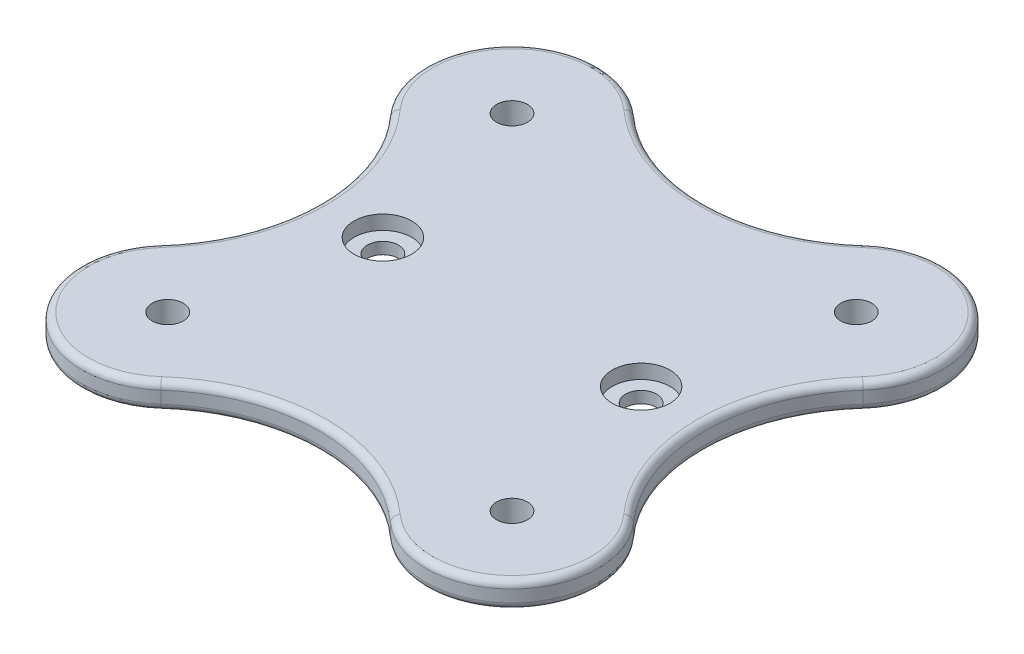
ISO-10303-21;
HEADER;
FILE_DESCRIPTION(('STEP AP214'),'2;1');
FILE_NAME('part.step','',(''),(''),'','','');
FILE_SCHEMA(('AUTOMOTIVE_DESIGN { 1 0 10303 214 1 1 1 1 }'));
ENDSEC;
DATA;
#1=APPLICATION_CONTEXT('core data for automotive mechanical design processes');
#2=APPLICATION_PROTOCOL_DEFINITION('international standard','automotive_design',2000,#1);
#3=PRODUCT_CONTEXT('',#1,'mechanical');
#4=PRODUCT('Part','Part','',(#3));
#5=PRODUCT_RELATED_PRODUCT_CATEGORY('part','',(#4));
#6=PRODUCT_DEFINITION_FORMATION('','',#4);
#7=PRODUCT_DEFINITION_CONTEXT('part definition',#1,'design');
#8=PRODUCT_DEFINITION('design','',#6,#7);
#9=PRODUCT_DEFINITION_SHAPE('','',#8);
#10=(LENGTH_UNIT() NAMED_UNIT(*) SI_UNIT(.MILLI.,.METRE.));
#11=(NAMED_UNIT(*) PLANE_ANGLE_UNIT() SI_UNIT($,.RADIAN.));
#12=(NAMED_UNIT(*) SI_UNIT($,.STERADIAN.) SOLID_ANGLE_UNIT());
#13=UNCERTAINTY_MEASURE_WITH_UNIT(LENGTH_MEASURE(1.E-05),#10,'distance_accuracy_value','');
#14=(GEOMETRIC_REPRESENTATION_CONTEXT(3) GLOBAL_UNCERTAINTY_ASSIGNED_CONTEXT((#13)) GLOBAL_UNIT_ASSIGNED_CONTEXT((#10,
#11,#12)) REPRESENTATION_CONTEXT('',''));
#15=CARTESIAN_POINT('',(0.,0.,0.));
#16=DIRECTION('',(0.,0.,1.));
#17=DIRECTION('',(1.,0.,0.));
#18=AXIS2_PLACEMENT_3D('',#15,#16,#17);
#19=CARTESIAN_POINT('',(20.,3.,-20.));
#20=DIRECTION('',(0.,-1.,0.));
#21=DIRECTION('',(0.,0.,-1.));
#22=AXIS2_PLACEMENT_3D('',#19,#20,#21);
#23=CYLINDRICAL_SURFACE('',#22,10.);
#24=DIRECTION('',(0.,-1.,0.));
#25=VECTOR('',#24,1.);
#26=CARTESIAN_POINT('',(27.4535599249993,3.,-13.3333333333333));
#27=LINE('',#26,#25);
#28=CARTESIAN_POINT('',(27.4535599249993,2.2,-13.3333333333333));
#29=VERTEX_POINT('',#28);
#30=CARTESIAN_POINT('',(27.4535599249993,0.8,-13.3333333333333));
#31=VERTEX_POINT('',#30);
#32=EDGE_CURVE('E377',#29,#31,#27,.T.);
#33=ORIENTED_EDGE('',*,*,#32,.T.);
#34=CARTESIAN_POINT('',(20.,0.8,-20.));
#35=DIRECTION('',(0.,1.,0.));
#36=DIRECTION('',(0.,0.,1.));
#37=AXIS2_PLACEMENT_3D('',#34,#35,#36);
#38=CIRCLE('',#37,10.);
#39=CARTESIAN_POINT('',(13.3333333333333,0.8,-27.4535599249993));
#40=VERTEX_POINT('',#39);
#41=EDGE_CURVE('E268',#31,#40,#38,.T.);
#42=ORIENTED_EDGE('',*,*,#41,.T.);
#43=DIRECTION('',(0.,-1.,0.));
#44=VECTOR('',#43,1.);
#45=CARTESIAN_POINT('',(13.3333333333333,3.,-27.4535599249993));
#46=LINE('',#45,#44);
#47=CARTESIAN_POINT('',(13.3333333333333,2.2,-27.4535599249993));
#48=VERTEX_POINT('',#47);
#49=EDGE_CURVE('E382',#40,#48,#46,.F.);
#50=ORIENTED_EDGE('',*,*,#49,.T.);
#51=CARTESIAN_POINT('',(20.,2.2,-20.));
#52=DIRECTION('',(0.,1.,0.));
#53=DIRECTION('',(0.,0.,1.));
#54=AXIS2_PLACEMENT_3D('',#51,#52,#53);
#55=CIRCLE('',#54,10.);
#56=EDGE_CURVE('E265',#48,#29,#55,.F.);
#57=ORIENTED_EDGE('',*,*,#56,.T.);
#58=EDGE_LOOP('',(#33,#42,#50,#57));
#59=FACE_BOUND('',#58,.T.);
#60=ADVANCED_FACE('F43',(#59),#23,.T.);
#61=CARTESIAN_POINT('',(-20.,3.,-20.));
#62=DIRECTION('',(0.,-1.,0.));
#63=DIRECTION('',(0.,0.,-1.));
#64=AXIS2_PLACEMENT_3D('',#61,#62,#63);
#65=CYLINDRICAL_SURFACE('',#64,9.99999999999999);
#66=DIRECTION('',(0.,-1.,0.));
#67=VECTOR('',#66,1.);
#68=CARTESIAN_POINT('',(-13.3333333333333,3.,-27.4535599249993));
#69=LINE('',#68,#67);
#70=CARTESIAN_POINT('',(-13.3333333333333,2.2,-27.4535599249993));
#71=VERTEX_POINT('',#70);
#72=CARTESIAN_POINT('',(-13.3333333333333,0.8,-27.4535599249993));
#73=VERTEX_POINT('',#72);
#74=EDGE_CURVE('E200',#71,#73,#69,.T.);
#75=ORIENTED_EDGE('',*,*,#74,.T.);
#76=CARTESIAN_POINT('',(-20.,0.8,-20.));
#77=DIRECTION('',(0.,1.,0.));
#78=DIRECTION('',(0.,0.,1.));
#79=AXIS2_PLACEMENT_3D('',#76,#77,#78);
#80=CIRCLE('',#79,9.99999999999999);
#81=CARTESIAN_POINT('',(-27.4535599249993,0.8,-13.3333333333333));
#82=VERTEX_POINT('',#81);
#83=EDGE_CURVE('E281',#73,#82,#80,.T.);
#84=ORIENTED_EDGE('',*,*,#83,.T.);
#85=DIRECTION('',(0.,-1.,0.));
#86=VECTOR('',#85,1.);
#87=CARTESIAN_POINT('',(-27.4535599249993,3.,-13.3333333333333));
#88=LINE('',#87,#86);
#89=CARTESIAN_POINT('',(-27.4535599249993,2.2,-13.3333333333333));
#90=VERTEX_POINT('',#89);
#91=EDGE_CURVE('E206',#82,#90,#88,.F.);
#92=ORIENTED_EDGE('',*,*,#91,.T.);
#93=CARTESIAN_POINT('',(-20.,2.2,-20.));
#94=DIRECTION('',(0.,1.,0.));
#95=DIRECTION('',(0.,0.,1.));
#96=AXIS2_PLACEMENT_3D('',#93,#94,#95);
#97=CIRCLE('',#96,9.99999999999999);
#98=EDGE_CURVE('E277',#90,#71,#97,.F.);
#99=ORIENTED_EDGE('',*,*,#98,.T.);
#100=EDGE_LOOP('',(#75,#84,#92,#99));
#101=FACE_BOUND('',#100,.T.);
#102=ADVANCED_FACE('F470',(#101),#65,.T.);
#103=CARTESIAN_POINT('',(-20.,3.,20.));
#104=DIRECTION('',(0.,-1.,0.));
#105=DIRECTION('',(0.,0.,-1.));
#106=AXIS2_PLACEMENT_3D('',#103,#104,#105);
#107=CYLINDRICAL_SURFACE('',#106,10.);
#108=DIRECTION('',(0.,-1.,0.));
#109=VECTOR('',#108,1.);
#110=CARTESIAN_POINT('',(-27.4535599249993,3.,13.3333333333333));
#111=LINE('',#110,#109);
#112=CARTESIAN_POINT('',(-27.4535599249993,2.2,13.3333333333333));
#113=VERTEX_POINT('',#112);
#114=CARTESIAN_POINT('',(-27.4535599249993,0.8,13.3333333333333));
#115=VERTEX_POINT('',#114);
#116=EDGE_CURVE('E191',#113,#115,#111,.T.);
#117=ORIENTED_EDGE('',*,*,#116,.T.);
#118=CARTESIAN_POINT('',(-20.,0.8,20.));
#119=DIRECTION('',(0.,1.,0.));
#120=DIRECTION('',(0.,0.,1.));
#121=AXIS2_PLACEMENT_3D('',#118,#119,#120);
#122=CIRCLE('',#121,10.);
#123=CARTESIAN_POINT('',(-13.3333333333333,0.8,27.4535599249993));
#124=VERTEX_POINT('',#123);
#125=EDGE_CURVE('E163',#115,#124,#122,.T.);
#126=ORIENTED_EDGE('',*,*,#125,.T.);
#127=DIRECTION('',(0.,-1.,0.));
#128=VECTOR('',#127,1.);
#129=CARTESIAN_POINT('',(-13.3333333333333,3.,27.4535599249993));
#130=LINE('',#129,#128);
#131=CARTESIAN_POINT('',(-13.3333333333333,2.2,27.4535599249993));
#132=VERTEX_POINT('',#131);
#133=EDGE_CURVE('E188',#124,#132,#130,.F.);
#134=ORIENTED_EDGE('',*,*,#133,.T.);
#135=CARTESIAN_POINT('',(-20.,2.2,20.));
#136=DIRECTION('',(0.,1.,0.));
#137=DIRECTION('',(0.,0.,1.));
#138=AXIS2_PLACEMENT_3D('',#135,#136,#137);
#139=CIRCLE('',#138,10.);
#140=EDGE_CURVE('E195',#132,#113,#139,.F.);
#141=ORIENTED_EDGE('',*,*,#140,.T.);
#142=EDGE_LOOP('',(#117,#126,#134,#141));
#143=FACE_BOUND('',#142,.T.);
#144=ADVANCED_FACE('F187',(#143),#107,.T.);
#145=CARTESIAN_POINT('',(20.,3.,20.));
#146=DIRECTION('',(0.,-1.,0.));
#147=DIRECTION('',(0.,0.,-1.));
#148=AXIS2_PLACEMENT_3D('',#145,#146,#147);
#149=CYLINDRICAL_SURFACE('',#148,9.99999999999999);
#150=DIRECTION('',(0.,-1.,0.));
#151=VECTOR('',#150,1.);
#152=CARTESIAN_POINT('',(13.3333333333333,3.,27.4535599249993));
#153=LINE('',#152,#151);
#154=CARTESIAN_POINT('',(13.3333333333333,2.2,27.4535599249993));
#155=VERTEX_POINT('',#154);
#156=CARTESIAN_POINT('',(13.3333333333333,0.8,27.4535599249993));
#157=VERTEX_POINT('',#156);
#158=EDGE_CURVE('E374',#155,#157,#153,.T.);
#159=ORIENTED_EDGE('',*,*,#158,.T.);
#160=CARTESIAN_POINT('',(20.,0.8,20.));
#161=DIRECTION('',(0.,1.,0.));
#162=DIRECTION('',(0.,0.,1.));
#163=AXIS2_PLACEMENT_3D('',#160,#161,#162);
#164=CIRCLE('',#163,9.99999999999999);
#165=CARTESIAN_POINT('',(27.4535599249993,0.8,13.3333333333333));
#166=VERTEX_POINT('',#165);
#167=EDGE_CURVE('E256',#157,#166,#164,.T.);
#168=ORIENTED_EDGE('',*,*,#167,.T.);
#169=DIRECTION('',(0.,-1.,0.));
#170=VECTOR('',#169,1.);
#171=CARTESIAN_POINT('',(27.4535599249993,3.,13.3333333333333));
#172=LINE('',#171,#170);
#173=CARTESIAN_POINT('',(27.4535599249993,2.2,13.3333333333333));
#174=VERTEX_POINT('',#173);
#175=EDGE_CURVE('E209',#166,#174,#172,.F.);
#176=ORIENTED_EDGE('',*,*,#175,.T.);
#177=CARTESIAN_POINT('',(20.,2.2,20.));
#178=DIRECTION('',(0.,1.,0.));
#179=DIRECTION('',(0.,0.,1.));
#180=AXIS2_PLACEMENT_3D('',#177,#178,#179);
#181=CIRCLE('',#180,9.99999999999999);
#182=EDGE_CURVE('E181',#174,#155,#181,.F.);
#183=ORIENTED_EDGE('',*,*,#182,.T.);
#184=EDGE_LOOP('',(#159,#168,#176,#183));
#185=FACE_BOUND('',#184,.T.);
#186=ADVANCED_FACE('F373',(#185),#149,.T.);
#187=CARTESIAN_POINT('',(0.,3.,0.));
#188=DIRECTION('',(0.,1.,0.));
#189=DIRECTION('',(0.,0.,1.));
#190=AXIS2_PLACEMENT_3D('',#187,#188,#189);
#191=PLANE('',#190);
#192=CARTESIAN_POINT('',(0.,3.,-42.3606797749979));
#193=DIRECTION('',(0.,1.,0.));
#194=DIRECTION('',(0.,0.,1.));
#195=AXIS2_PLACEMENT_3D('',#192,#193,#194);
#196=CIRCLE('',#195,20.8);
#197=CARTESIAN_POINT('',(13.8666666666667,3.,-26.8572751309994));
#198=VERTEX_POINT('',#197);
#199=CARTESIAN_POINT('',(-13.8666666666667,3.,-26.8572751309994));
#200=VERTEX_POINT('',#199);
#201=EDGE_CURVE('E61',#198,#200,#196,.F.);
#202=ORIENTED_EDGE('',*,*,#201,.T.);
#203=CARTESIAN_POINT('',(-20.,3.,-20.));
#204=DIRECTION('',(0.,1.,0.));
#205=DIRECTION('',(0.,0.,1.));
#206=AXIS2_PLACEMENT_3D('',#203,#204,#205);
#207=CIRCLE('',#206,9.19999999999999);
#208=CARTESIAN_POINT('',(-26.8572751309994,3.,-13.8666666666667));
#209=VERTEX_POINT('',#208);
#210=EDGE_CURVE('E302',#200,#209,#207,.T.);
#211=ORIENTED_EDGE('',*,*,#210,.T.);
#212=CARTESIAN_POINT('',(-42.3606797749979,3.,0.));
#213=DIRECTION('',(0.,1.,0.));
#214=DIRECTION('',(0.,0.,1.));
#215=AXIS2_PLACEMENT_3D('',#212,#213,#214);
#216=CIRCLE('',#215,20.8);
#217=CARTESIAN_POINT('',(-26.8572751309994,3.,13.8666666666667));
#218=VERTEX_POINT('',#217);
#219=EDGE_CURVE('E284',#209,#218,#216,.F.);
#220=ORIENTED_EDGE('',*,*,#219,.T.);
#221=CARTESIAN_POINT('',(-20.,3.,20.));
#222=DIRECTION('',(0.,1.,0.));
#223=DIRECTION('',(0.,0.,1.));
#224=AXIS2_PLACEMENT_3D('',#221,#222,#223);
#225=CIRCLE('',#224,9.20000000000001);
#226=CARTESIAN_POINT('',(-13.8666666666667,3.,26.8572751309994));
#227=VERTEX_POINT('',#226);
#228=EDGE_CURVE('E287',#218,#227,#225,.T.);
#229=ORIENTED_EDGE('',*,*,#228,.T.);
#230=CARTESIAN_POINT('',(0.,3.,42.3606797749979));
#231=DIRECTION('',(0.,1.,0.));
#232=DIRECTION('',(0.,0.,1.));
#233=AXIS2_PLACEMENT_3D('',#230,#231,#232);
#234=CIRCLE('',#233,20.8);
#235=CARTESIAN_POINT('',(13.8666666666667,3.,26.8572751309994));
#236=VERTEX_POINT('',#235);
#237=EDGE_CURVE('E290',#227,#236,#234,.F.);
#238=ORIENTED_EDGE('',*,*,#237,.T.);
#239=CARTESIAN_POINT('',(20.,3.,20.));
#240=DIRECTION('',(0.,1.,0.));
#241=DIRECTION('',(0.,0.,1.));
#242=AXIS2_PLACEMENT_3D('',#239,#240,#241);
#243=CIRCLE('',#242,9.19999999999999);
#244=CARTESIAN_POINT('',(26.8572751309993,3.,13.8666666666667));
#245=VERTEX_POINT('',#244);
#246=EDGE_CURVE('E293',#236,#245,#243,.T.);
#247=ORIENTED_EDGE('',*,*,#246,.T.);
#248=CARTESIAN_POINT('',(42.3606797749979,3.,0.));
#249=DIRECTION('',(0.,1.,0.));
#250=DIRECTION('',(0.,0.,1.));
#251=AXIS2_PLACEMENT_3D('',#248,#249,#250);
#252=CIRCLE('',#251,20.8);
#253=CARTESIAN_POINT('',(26.8572751309994,3.,-13.8666666666667));
#254=VERTEX_POINT('',#253);
#255=EDGE_CURVE('E296',#245,#254,#252,.F.);
#256=ORIENTED_EDGE('',*,*,#255,.T.);
#257=CARTESIAN_POINT('',(20.,3.,-20.));
#258=DIRECTION('',(0.,1.,0.));
#259=DIRECTION('',(0.,0.,1.));
#260=AXIS2_PLACEMENT_3D('',#257,#258,#259);
#261=CIRCLE('',#260,9.20000000000001);
#262=EDGE_CURVE('E66',#254,#198,#261,.T.);
#263=ORIENTED_EDGE('',*,*,#262,.T.);
#264=EDGE_LOOP('',(#202,#211,#220,#229,#238,#247,#256,#263));
#265=FACE_BOUND('',#264,.T.);
#266=CARTESIAN_POINT('',(15.,3.,0.));
#267=DIRECTION('',(0.,1.,0.));
#268=DIRECTION('',(0.,0.,1.));
#269=AXIS2_PLACEMENT_3D('',#266,#267,#268);
#270=CIRCLE('',#269,3.35);
#271=CARTESIAN_POINT('',(15.,3.,3.34999999999999));
#272=VERTEX_POINT('',#271);
#273=EDGE_CURVE('E331',#272,#272,#270,.T.);
#274=ORIENTED_EDGE('',*,*,#273,.F.);
#275=EDGE_LOOP('',(#274));
#276=FACE_BOUND('',#275,.T.);
#277=CARTESIAN_POINT('',(-15.,3.,0.));
#278=DIRECTION('',(0.,1.,0.));
#279=DIRECTION('',(0.,0.,1.));
#280=AXIS2_PLACEMENT_3D('',#277,#278,#279);
#281=CIRCLE('',#280,3.35);
#282=CARTESIAN_POINT('',(-15.,3.,3.35));
#283=VERTEX_POINT('',#282);
#284=EDGE_CURVE('E226',#283,#283,#281,.T.);
#285=ORIENTED_EDGE('',*,*,#284,.F.);
#286=EDGE_LOOP('',(#285));
#287=FACE_BOUND('',#286,.T.);
#288=CARTESIAN_POINT('',(-20.,3.,-20.));
#289=DIRECTION('',(0.,1.,0.));
#290=DIRECTION('',(0.,0.,1.));
#291=AXIS2_PLACEMENT_3D('',#288,#289,#290);
#292=CIRCLE('',#291,1.8);
#293=CARTESIAN_POINT('',(-20.,3.,-18.2));
#294=VERTEX_POINT('',#293);
#295=EDGE_CURVE('E220',#294,#294,#292,.T.);
#296=ORIENTED_EDGE('',*,*,#295,.F.);
#297=EDGE_LOOP('',(#296));
#298=FACE_BOUND('',#297,.T.);
#299=CARTESIAN_POINT('',(20.,3.,20.));
#300=DIRECTION('',(0.,1.,0.));
#301=DIRECTION('',(0.,0.,1.));
#302=AXIS2_PLACEMENT_3D('',#299,#300,#301);
#303=CIRCLE('',#302,1.8);
#304=CARTESIAN_POINT('',(20.,3.,21.8));
#305=VERTEX_POINT('',#304);
#306=EDGE_CURVE('E393',#305,#305,#303,.T.);
#307=ORIENTED_EDGE('',*,*,#306,.F.);
#308=EDGE_LOOP('',(#307));
#309=FACE_BOUND('',#308,.T.);
#310=CARTESIAN_POINT('',(-20.,3.,20.));
#311=DIRECTION('',(0.,1.,0.));
#312=DIRECTION('',(0.,0.,1.));
#313=AXIS2_PLACEMENT_3D('',#310,#311,#312);
#314=CIRCLE('',#313,1.8);
#315=CARTESIAN_POINT('',(-20.,3.,21.8));
#316=VERTEX_POINT('',#315);
#317=EDGE_CURVE('E399',#316,#316,#314,.T.);
#318=ORIENTED_EDGE('',*,*,#317,.F.);
#319=EDGE_LOOP('',(#318));
#320=FACE_BOUND('',#319,.T.);
#321=CARTESIAN_POINT('',(20.,3.,-20.));
#322=DIRECTION('',(0.,1.,0.));
#323=DIRECTION('',(0.,0.,1.));
#324=AXIS2_PLACEMENT_3D('',#321,#322,#323);
#325=CIRCLE('',#324,1.8);
#326=CARTESIAN_POINT('',(20.,3.,-18.2));
#327=VERTEX_POINT('',#326);
#328=EDGE_CURVE('E398',#327,#327,#325,.T.);
#329=ORIENTED_EDGE('',*,*,#328,.F.);
#330=EDGE_LOOP('',(#329));
#331=FACE_BOUND('',#330,.T.);
#332=ADVANCED_FACE('F441',(#265,#276,#287,#298,#309,#320,#331),#191,.T.);
#333=CARTESIAN_POINT('',(0.,0.,0.));
#334=DIRECTION('',(0.,1.,0.));
#335=DIRECTION('',(0.,0.,1.));
#336=AXIS2_PLACEMENT_3D('',#333,#334,#335);
#337=PLANE('',#336);
#338=CARTESIAN_POINT('',(0.,0.,42.3606797749979));
#339=DIRECTION('',(0.,1.,0.));
#340=DIRECTION('',(0.,0.,1.));
#341=AXIS2_PLACEMENT_3D('',#338,#339,#340);
#342=CIRCLE('',#341,20.8);
#343=CARTESIAN_POINT('',(13.8666666666667,0.,26.8572751309994));
#344=VERTEX_POINT('',#343);
#345=CARTESIAN_POINT('',(-13.8666666666666,0.,26.8572751309994));
#346=VERTEX_POINT('',#345);
#347=EDGE_CURVE('E247',#344,#346,#342,.T.);
#348=ORIENTED_EDGE('',*,*,#347,.T.);
#349=CARTESIAN_POINT('',(-20.,0.,20.));
#350=DIRECTION('',(0.,1.,0.));
#351=DIRECTION('',(0.,0.,1.));
#352=AXIS2_PLACEMENT_3D('',#349,#350,#351);
#353=CIRCLE('',#352,9.20000000000001);
#354=CARTESIAN_POINT('',(-26.8572751309994,0.,13.8666666666667));
#355=VERTEX_POINT('',#354);
#356=EDGE_CURVE('E165',#346,#355,#353,.F.);
#357=ORIENTED_EDGE('',*,*,#356,.T.);
#358=CARTESIAN_POINT('',(-42.3606797749979,0.,0.));
#359=DIRECTION('',(0.,1.,0.));
#360=DIRECTION('',(0.,0.,1.));
#361=AXIS2_PLACEMENT_3D('',#358,#359,#360);
#362=CIRCLE('',#361,20.8);
#363=CARTESIAN_POINT('',(-26.8572751309994,0.,-13.8666666666667));
#364=VERTEX_POINT('',#363);
#365=EDGE_CURVE('E194',#355,#364,#362,.T.);
#366=ORIENTED_EDGE('',*,*,#365,.T.);
#367=CARTESIAN_POINT('',(-20.,0.,-20.));
#368=DIRECTION('',(0.,1.,0.));
#369=DIRECTION('',(0.,0.,1.));
#370=AXIS2_PLACEMENT_3D('',#367,#368,#369);
#371=CIRCLE('',#370,9.19999999999999);
#372=CARTESIAN_POINT('',(-13.8666666666667,0.,-26.8572751309994));
#373=VERTEX_POINT('',#372);
#374=EDGE_CURVE('E232',#364,#373,#371,.F.);
#375=ORIENTED_EDGE('',*,*,#374,.T.);
#376=CARTESIAN_POINT('',(0.,0.,-42.3606797749979));
#377=DIRECTION('',(0.,1.,0.));
#378=DIRECTION('',(0.,0.,1.));
#379=AXIS2_PLACEMENT_3D('',#376,#377,#378);
#380=CIRCLE('',#379,20.8);
#381=CARTESIAN_POINT('',(13.8666666666667,0.,-26.8572751309994));
#382=VERTEX_POINT('',#381);
#383=EDGE_CURVE('E235',#373,#382,#380,.T.);
#384=ORIENTED_EDGE('',*,*,#383,.T.);
#385=CARTESIAN_POINT('',(20.,0.,-20.));
#386=DIRECTION('',(0.,1.,0.));
#387=DIRECTION('',(0.,0.,1.));
#388=AXIS2_PLACEMENT_3D('',#385,#386,#387);
#389=CIRCLE('',#388,9.20000000000001);
#390=CARTESIAN_POINT('',(26.8572751309994,0.,-13.8666666666667));
#391=VERTEX_POINT('',#390);
#392=EDGE_CURVE('E238',#382,#391,#389,.F.);
#393=ORIENTED_EDGE('',*,*,#392,.T.);
#394=CARTESIAN_POINT('',(42.3606797749979,0.,0.));
#395=DIRECTION('',(0.,1.,0.));
#396=DIRECTION('',(0.,0.,1.));
#397=AXIS2_PLACEMENT_3D('',#394,#395,#396);
#398=CIRCLE('',#397,20.8);
#399=CARTESIAN_POINT('',(26.8572751309994,0.,13.8666666666667));
#400=VERTEX_POINT('',#399);
#401=EDGE_CURVE('E241',#391,#400,#398,.T.);
#402=ORIENTED_EDGE('',*,*,#401,.T.);
#403=CARTESIAN_POINT('',(20.,0.,20.));
#404=DIRECTION('',(0.,1.,0.));
#405=DIRECTION('',(0.,0.,1.));
#406=AXIS2_PLACEMENT_3D('',#403,#404,#405);
#407=CIRCLE('',#406,9.19999999999999);
#408=EDGE_CURVE('E244',#400,#344,#407,.F.);
#409=ORIENTED_EDGE('',*,*,#408,.T.);
#410=EDGE_LOOP('',(#348,#357,#366,#375,#384,#393,#402,#409));
#411=FACE_BOUND('',#410,.T.);
#412=CARTESIAN_POINT('',(15.,0.,0.));
#413=DIRECTION('',(0.,1.,0.));
#414=DIRECTION('',(0.,0.,1.));
#415=AXIS2_PLACEMENT_3D('',#412,#413,#414);
#416=CIRCLE('',#415,1.8);
#417=CARTESIAN_POINT('',(15.,0.,1.8));
#418=VERTEX_POINT('',#417);
#419=EDGE_CURVE('E222',#418,#418,#416,.T.);
#420=ORIENTED_EDGE('',*,*,#419,.T.);
#421=EDGE_LOOP('',(#420));
#422=FACE_BOUND('',#421,.T.);
#423=CARTESIAN_POINT('',(-15.,0.,0.));
#424=DIRECTION('',(0.,1.,0.));
#425=DIRECTION('',(0.,0.,1.));
#426=AXIS2_PLACEMENT_3D('',#423,#424,#425);
#427=CIRCLE('',#426,1.8);
#428=CARTESIAN_POINT('',(-15.,0.,1.8));
#429=VERTEX_POINT('',#428);
#430=EDGE_CURVE('E216',#429,#429,#427,.T.);
#431=ORIENTED_EDGE('',*,*,#430,.T.);
#432=EDGE_LOOP('',(#431));
#433=FACE_BOUND('',#432,.T.);
#434=CARTESIAN_POINT('',(-20.,0.,-20.));
#435=DIRECTION('',(0.,1.,0.));
#436=DIRECTION('',(0.,0.,1.));
#437=AXIS2_PLACEMENT_3D('',#434,#435,#436);
#438=CIRCLE('',#437,1.8);
#439=CARTESIAN_POINT('',(-20.,0.,-18.2));
#440=VERTEX_POINT('',#439);
#441=EDGE_CURVE('E389',#440,#440,#438,.T.);
#442=ORIENTED_EDGE('',*,*,#441,.T.);
#443=EDGE_LOOP('',(#442));
#444=FACE_BOUND('',#443,.T.);
#445=CARTESIAN_POINT('',(20.,0.,20.));
#446=DIRECTION('',(0.,1.,0.));
#447=DIRECTION('',(0.,0.,1.));
#448=AXIS2_PLACEMENT_3D('',#445,#446,#447);
#449=CIRCLE('',#448,1.8);
#450=CARTESIAN_POINT('',(20.,0.,21.8));
#451=VERTEX_POINT('',#450);
#452=EDGE_CURVE('E409',#451,#451,#449,.T.);
#453=ORIENTED_EDGE('',*,*,#452,.T.);
#454=EDGE_LOOP('',(#453));
#455=FACE_BOUND('',#454,.T.);
#456=CARTESIAN_POINT('',(-20.,0.,20.));
#457=DIRECTION('',(0.,1.,0.));
#458=DIRECTION('',(0.,0.,1.));
#459=AXIS2_PLACEMENT_3D('',#456,#457,#458);
#460=CIRCLE('',#459,1.8);
#461=CARTESIAN_POINT('',(-20.,0.,21.8));
#462=VERTEX_POINT('',#461);
#463=EDGE_CURVE('E394',#462,#462,#460,.T.);
#464=ORIENTED_EDGE('',*,*,#463,.T.);
#465=EDGE_LOOP('',(#464));
#466=FACE_BOUND('',#465,.T.);
#467=CARTESIAN_POINT('',(20.,0.,-20.));
#468=DIRECTION('',(0.,1.,0.));
#469=DIRECTION('',(0.,0.,1.));
#470=AXIS2_PLACEMENT_3D('',#467,#468,#469);
#471=CIRCLE('',#470,1.8);
#472=CARTESIAN_POINT('',(20.,0.,-18.2));
#473=VERTEX_POINT('',#472);
#474=EDGE_CURVE('E388',#473,#473,#471,.T.);
#475=ORIENTED_EDGE('',*,*,#474,.T.);
#476=EDGE_LOOP('',(#475));
#477=FACE_BOUND('',#476,.T.);
#478=ADVANCED_FACE('F444',(#411,#422,#433,#444,#455,#466,#477),#337,.F.);
#479=CARTESIAN_POINT('',(20.,3.,-20.));
#480=DIRECTION('',(0.,1.,0.));
#481=DIRECTION('',(0.,0.,1.));
#482=AXIS2_PLACEMENT_3D('',#479,#480,#481);
#483=CYLINDRICAL_SURFACE('',#482,1.8);
#484=ORIENTED_EDGE('',*,*,#328,.T.);
#485=EDGE_LOOP('',(#484));
#486=FACE_BOUND('',#485,.T.);
#487=ORIENTED_EDGE('',*,*,#474,.F.);
#488=EDGE_LOOP('',(#487));
#489=FACE_BOUND('',#488,.T.);
#490=ADVANCED_FACE('F456',(#486,#489),#483,.F.);
#491=CARTESIAN_POINT('',(-20.,3.,20.));
#492=DIRECTION('',(0.,1.,0.));
#493=DIRECTION('',(0.,0.,1.));
#494=AXIS2_PLACEMENT_3D('',#491,#492,#493);
#495=CYLINDRICAL_SURFACE('',#494,1.8);
#496=ORIENTED_EDGE('',*,*,#317,.T.);
#497=EDGE_LOOP('',(#496));
#498=FACE_BOUND('',#497,.T.);
#499=ORIENTED_EDGE('',*,*,#463,.F.);
#500=EDGE_LOOP('',(#499));
#501=FACE_BOUND('',#500,.T.);
#502=ADVANCED_FACE('F459',(#498,#501),#495,.F.);
#503=CARTESIAN_POINT('',(20.,3.,20.));
#504=DIRECTION('',(0.,1.,0.));
#505=DIRECTION('',(0.,0.,1.));
#506=AXIS2_PLACEMENT_3D('',#503,#504,#505);
#507=CYLINDRICAL_SURFACE('',#506,1.8);
#508=ORIENTED_EDGE('',*,*,#306,.T.);
#509=EDGE_LOOP('',(#508));
#510=FACE_BOUND('',#509,.T.);
#511=ORIENTED_EDGE('',*,*,#452,.F.);
#512=EDGE_LOOP('',(#511));
#513=FACE_BOUND('',#512,.T.);
#514=ADVANCED_FACE('F630',(#510,#513),#507,.F.);
#515=CARTESIAN_POINT('',(-20.,3.,-20.));
#516=DIRECTION('',(0.,1.,0.));
#517=DIRECTION('',(0.,0.,1.));
#518=AXIS2_PLACEMENT_3D('',#515,#516,#517);
#519=CYLINDRICAL_SURFACE('',#518,1.8);
#520=ORIENTED_EDGE('',*,*,#295,.T.);
#521=EDGE_LOOP('',(#520));
#522=FACE_BOUND('',#521,.T.);
#523=ORIENTED_EDGE('',*,*,#441,.F.);
#524=EDGE_LOOP('',(#523));
#525=FACE_BOUND('',#524,.T.);
#526=ADVANCED_FACE('F482',(#522,#525),#519,.F.);
#527=CARTESIAN_POINT('',(42.3606797749979,3.,0.));
#528=DIRECTION('',(0.,1.,0.));
#529=DIRECTION('',(0.,0.,1.));
#530=AXIS2_PLACEMENT_3D('',#527,#528,#529);
#531=CYLINDRICAL_SURFACE('',#530,20.);
#532=ORIENTED_EDGE('',*,*,#175,.F.);
#533=CARTESIAN_POINT('',(42.3606797749979,0.8,0.));
#534=DIRECTION('',(0.,1.,0.));
#535=DIRECTION('',(0.,0.,1.));
#536=AXIS2_PLACEMENT_3D('',#533,#534,#535);
#537=CIRCLE('',#536,20.);
#538=EDGE_CURVE('E262',#166,#31,#537,.F.);
#539=ORIENTED_EDGE('',*,*,#538,.T.);
#540=ORIENTED_EDGE('',*,*,#32,.F.);
#541=CARTESIAN_POINT('',(42.3606797749979,2.2,0.));
#542=DIRECTION('',(0.,1.,0.));
#543=DIRECTION('',(0.,0.,1.));
#544=AXIS2_PLACEMENT_3D('',#541,#542,#543);
#545=CIRCLE('',#544,20.);
#546=EDGE_CURVE('E259',#29,#174,#545,.T.);
#547=ORIENTED_EDGE('',*,*,#546,.T.);
#548=EDGE_LOOP('',(#532,#539,#540,#547));
#549=FACE_BOUND('',#548,.T.);
#550=ADVANCED_FACE('F479',(#549),#531,.F.);
#551=CARTESIAN_POINT('',(0.,3.,42.3606797749979));
#552=DIRECTION('',(0.,1.,0.));
#553=DIRECTION('',(0.,0.,1.));
#554=AXIS2_PLACEMENT_3D('',#551,#552,#553);
#555=CYLINDRICAL_SURFACE('',#554,20.);
#556=ORIENTED_EDGE('',*,*,#133,.F.);
#557=CARTESIAN_POINT('',(0.,0.8,42.3606797749979));
#558=DIRECTION('',(0.,1.,0.));
#559=DIRECTION('',(0.,0.,1.));
#560=AXIS2_PLACEMENT_3D('',#557,#558,#559);
#561=CIRCLE('',#560,20.);
#562=EDGE_CURVE('E172',#124,#157,#561,.F.);
#563=ORIENTED_EDGE('',*,*,#562,.T.);
#564=ORIENTED_EDGE('',*,*,#158,.F.);
#565=CARTESIAN_POINT('',(0.,2.2,42.3606797749979));
#566=DIRECTION('',(0.,1.,0.));
#567=DIRECTION('',(0.,0.,1.));
#568=AXIS2_PLACEMENT_3D('',#565,#566,#567);
#569=CIRCLE('',#568,20.);
#570=EDGE_CURVE('E182',#155,#132,#569,.T.);
#571=ORIENTED_EDGE('',*,*,#570,.T.);
#572=EDGE_LOOP('',(#556,#563,#564,#571));
#573=FACE_BOUND('',#572,.T.);
#574=ADVANCED_FACE('F197',(#573),#555,.F.);
#575=CARTESIAN_POINT('',(-42.3606797749979,3.,0.));
#576=DIRECTION('',(0.,1.,0.));
#577=DIRECTION('',(0.,0.,1.));
#578=AXIS2_PLACEMENT_3D('',#575,#576,#577);
#579=CYLINDRICAL_SURFACE('',#578,20.);
#580=ORIENTED_EDGE('',*,*,#91,.F.);
#581=CARTESIAN_POINT('',(-42.3606797749979,0.8,0.));
#582=DIRECTION('',(0.,1.,0.));
#583=DIRECTION('',(0.,0.,1.));
#584=AXIS2_PLACEMENT_3D('',#581,#582,#583);
#585=CIRCLE('',#584,20.);
#586=EDGE_CURVE('E11',#82,#115,#585,.F.);
#587=ORIENTED_EDGE('',*,*,#586,.T.);
#588=ORIENTED_EDGE('',*,*,#116,.F.);
#589=CARTESIAN_POINT('',(-42.3606797749979,2.2,0.));
#590=DIRECTION('',(0.,1.,0.));
#591=DIRECTION('',(0.,0.,1.));
#592=AXIS2_PLACEMENT_3D('',#589,#590,#591);
#593=CIRCLE('',#592,20.);
#594=EDGE_CURVE('E53',#113,#90,#593,.T.);
#595=ORIENTED_EDGE('',*,*,#594,.T.);
#596=EDGE_LOOP('',(#580,#587,#588,#595));
#597=FACE_BOUND('',#596,.T.);
#598=ADVANCED_FACE('F486',(#597),#579,.F.);
#599=CARTESIAN_POINT('',(0.,3.,-42.3606797749979));
#600=DIRECTION('',(0.,1.,0.));
#601=DIRECTION('',(0.,0.,1.));
#602=AXIS2_PLACEMENT_3D('',#599,#600,#601);
#603=CYLINDRICAL_SURFACE('',#602,20.);
#604=ORIENTED_EDGE('',*,*,#49,.F.);
#605=CARTESIAN_POINT('',(0.,0.8,-42.3606797749979));
#606=DIRECTION('',(0.,1.,0.));
#607=DIRECTION('',(0.,0.,1.));
#608=AXIS2_PLACEMENT_3D('',#605,#606,#607);
#609=CIRCLE('',#608,20.);
#610=EDGE_CURVE('E274',#40,#73,#609,.F.);
#611=ORIENTED_EDGE('',*,*,#610,.T.);
#612=ORIENTED_EDGE('',*,*,#74,.F.);
#613=CARTESIAN_POINT('',(0.,2.2,-42.3606797749979));
#614=DIRECTION('',(0.,1.,0.));
#615=DIRECTION('',(0.,0.,1.));
#616=AXIS2_PLACEMENT_3D('',#613,#614,#615);
#617=CIRCLE('',#616,20.);
#618=EDGE_CURVE('E271',#71,#48,#617,.T.);
#619=ORIENTED_EDGE('',*,*,#618,.T.);
#620=EDGE_LOOP('',(#604,#611,#612,#619));
#621=FACE_BOUND('',#620,.T.);
#622=ADVANCED_FACE('F489',(#621),#603,.F.);
#623=CARTESIAN_POINT('',(-15.,3.,0.));
#624=DIRECTION('',(0.,1.,0.));
#625=DIRECTION('',(0.,0.,1.));
#626=AXIS2_PLACEMENT_3D('',#623,#624,#625);
#627=CYLINDRICAL_SURFACE('',#626,1.8);
#628=CARTESIAN_POINT('',(-15.,1.35,0.));
#629=DIRECTION('',(0.,1.,0.));
#630=DIRECTION('',(0.,0.,1.));
#631=AXIS2_PLACEMENT_3D('',#628,#629,#630);
#632=CIRCLE('',#631,1.8);
#633=CARTESIAN_POINT('',(-15.,1.35,1.8));
#634=VERTEX_POINT('',#633);
#635=EDGE_CURVE('E221',#634,#634,#632,.T.);
#636=ORIENTED_EDGE('',*,*,#635,.T.);
#637=EDGE_LOOP('',(#636));
#638=FACE_BOUND('',#637,.T.);
#639=ORIENTED_EDGE('',*,*,#430,.F.);
#640=EDGE_LOOP('',(#639));
#641=FACE_BOUND('',#640,.T.);
#642=ADVANCED_FACE('F493',(#638,#641),#627,.F.);
#643=CARTESIAN_POINT('',(-13.2,1.35,0.));
#644=DIRECTION('',(0.,-1.,0.));
#645=DIRECTION('',(0.,0.,-1.));
#646=AXIS2_PLACEMENT_3D('',#643,#644,#645);
#647=PLANE('',#646);
#648=ORIENTED_EDGE('',*,*,#635,.F.);
#649=EDGE_LOOP('',(#648));
#650=FACE_BOUND('',#649,.T.);
#651=CARTESIAN_POINT('',(-15.,1.35,0.));
#652=DIRECTION('',(0.,1.,0.));
#653=DIRECTION('',(0.,0.,1.));
#654=AXIS2_PLACEMENT_3D('',#651,#652,#653);
#655=CIRCLE('',#654,3.35);
#656=CARTESIAN_POINT('',(-15.,1.35,3.35));
#657=VERTEX_POINT('',#656);
#658=EDGE_CURVE('E422',#657,#657,#655,.T.);
#659=ORIENTED_EDGE('',*,*,#658,.T.);
#660=EDGE_LOOP('',(#659));
#661=FACE_BOUND('',#660,.T.);
#662=ADVANCED_FACE('F600',(#650,#661),#647,.F.);
#663=CARTESIAN_POINT('',(-15.,3.,0.));
#664=DIRECTION('',(0.,1.,0.));
#665=DIRECTION('',(0.,0.,1.));
#666=AXIS2_PLACEMENT_3D('',#663,#664,#665);
#667=CYLINDRICAL_SURFACE('',#666,3.35);
#668=ORIENTED_EDGE('',*,*,#658,.F.);
#669=EDGE_LOOP('',(#668));
#670=FACE_BOUND('',#669,.T.);
#671=ORIENTED_EDGE('',*,*,#284,.T.);
#672=EDGE_LOOP('',(#671));
#673=FACE_BOUND('',#672,.T.);
#674=ADVANCED_FACE('F593',(#670,#673),#667,.F.);
#675=CARTESIAN_POINT('',(15.,3.,0.));
#676=DIRECTION('',(0.,1.,0.));
#677=DIRECTION('',(0.,0.,1.));
#678=AXIS2_PLACEMENT_3D('',#675,#676,#677);
#679=CYLINDRICAL_SURFACE('',#678,1.8);
#680=CARTESIAN_POINT('',(15.,1.35,0.));
#681=DIRECTION('',(0.,1.,0.));
#682=DIRECTION('',(0.,0.,1.));
#683=AXIS2_PLACEMENT_3D('',#680,#681,#682);
#684=CIRCLE('',#683,1.8);
#685=CARTESIAN_POINT('',(15.,1.35,1.8));
#686=VERTEX_POINT('',#685);
#687=EDGE_CURVE('E227',#686,#686,#684,.T.);
#688=ORIENTED_EDGE('',*,*,#687,.T.);
#689=EDGE_LOOP('',(#688));
#690=FACE_BOUND('',#689,.T.);
#691=ORIENTED_EDGE('',*,*,#419,.F.);
#692=EDGE_LOOP('',(#691));
#693=FACE_BOUND('',#692,.T.);
#694=ADVANCED_FACE('F586',(#690,#693),#679,.F.);
#695=CARTESIAN_POINT('',(16.8,1.35,0.));
#696=DIRECTION('',(0.,-1.,0.));
#697=DIRECTION('',(0.,0.,-1.));
#698=AXIS2_PLACEMENT_3D('',#695,#696,#697);
#699=PLANE('',#698);
#700=ORIENTED_EDGE('',*,*,#687,.F.);
#701=EDGE_LOOP('',(#700));
#702=FACE_BOUND('',#701,.T.);
#703=CARTESIAN_POINT('',(15.,1.35,0.));
#704=DIRECTION('',(0.,1.,0.));
#705=DIRECTION('',(0.,0.,1.));
#706=AXIS2_PLACEMENT_3D('',#703,#704,#705);
#707=CIRCLE('',#706,3.35);
#708=CARTESIAN_POINT('',(15.,1.35,3.34999999999999));
#709=VERTEX_POINT('',#708);
#710=EDGE_CURVE('E431',#709,#709,#707,.T.);
#711=ORIENTED_EDGE('',*,*,#710,.T.);
#712=EDGE_LOOP('',(#711));
#713=FACE_BOUND('',#712,.T.);
#714=ADVANCED_FACE('F579',(#702,#713),#699,.F.);
#715=CARTESIAN_POINT('',(15.,3.,0.));
#716=DIRECTION('',(0.,1.,0.));
#717=DIRECTION('',(0.,0.,1.));
#718=AXIS2_PLACEMENT_3D('',#715,#716,#717);
#719=CYLINDRICAL_SURFACE('',#718,3.35);
#720=ORIENTED_EDGE('',*,*,#710,.F.);
#721=EDGE_LOOP('',(#720));
#722=FACE_BOUND('',#721,.T.);
#723=ORIENTED_EDGE('',*,*,#273,.T.);
#724=EDGE_LOOP('',(#723));
#725=FACE_BOUND('',#724,.T.);
#726=ADVANCED_FACE('F439',(#722,#725),#719,.F.);
#727=CARTESIAN_POINT('',(20.,0.8,-20.));
#728=DIRECTION('',(0.,1.,0.));
#729=DIRECTION('',(0.,0.,1.));
#730=AXIS2_PLACEMENT_3D('',#727,#728,#729);
#731=TOROIDAL_SURFACE('',#730,9.20000000000001,0.8);
#732=CARTESIAN_POINT('',(26.8572751309994,0.8,-13.8666666666667));
#733=DIRECTION('',(-0.666666666666666,0.,0.74535599249993));
#734=DIRECTION('',(0.74535599249993,0.,0.666666666666666));
#735=AXIS2_PLACEMENT_3D('',#732,#733,#734);
#736=CIRCLE('',#735,0.8);
#737=EDGE_CURVE('E323',#391,#31,#736,.T.);
#738=ORIENTED_EDGE('',*,*,#737,.F.);
#739=ORIENTED_EDGE('',*,*,#392,.F.);
#740=CARTESIAN_POINT('',(13.8666666666667,0.8,-26.8572751309994));
#741=DIRECTION('',(-0.74535599249993,0.,0.666666666666666));
#742=DIRECTION('',(0.666666666666666,0.,0.74535599249993));
#743=AXIS2_PLACEMENT_3D('',#740,#741,#742);
#744=CIRCLE('',#743,0.8);
#745=EDGE_CURVE('E327',#40,#382,#744,.T.);
#746=ORIENTED_EDGE('',*,*,#745,.F.);
#747=ORIENTED_EDGE('',*,*,#41,.F.);
#748=EDGE_LOOP('',(#738,#739,#746,#747));
#749=FACE_BOUND('',#748,.T.);
#750=ADVANCED_FACE('F518',(#749),#731,.T.);
#751=CARTESIAN_POINT('',(0.,0.8,-42.3606797749979));
#752=DIRECTION('',(0.,1.,0.));
#753=DIRECTION('',(0.,0.,1.));
#754=AXIS2_PLACEMENT_3D('',#751,#752,#753);
#755=TOROIDAL_SURFACE('',#754,20.8,0.8);
#756=ORIENTED_EDGE('',*,*,#745,.T.);
#757=ORIENTED_EDGE('',*,*,#383,.F.);
#758=CARTESIAN_POINT('',(-13.8666666666667,0.8,-26.8572751309994));
#759=DIRECTION('',(-0.74535599249993,0.,-0.666666666666666));
#760=DIRECTION('',(-0.666666666666666,0.,0.74535599249993));
#761=AXIS2_PLACEMENT_3D('',#758,#759,#760);
#762=CIRCLE('',#761,0.8);
#763=EDGE_CURVE('E319',#73,#373,#762,.T.);
#764=ORIENTED_EDGE('',*,*,#763,.F.);
#765=ORIENTED_EDGE('',*,*,#610,.F.);
#766=EDGE_LOOP('',(#756,#757,#764,#765));
#767=FACE_BOUND('',#766,.T.);
#768=ADVANCED_FACE('F514',(#767),#755,.T.);
#769=CARTESIAN_POINT('',(42.3606797749979,0.8,0.));
#770=DIRECTION('',(0.,1.,0.));
#771=DIRECTION('',(0.,0.,1.));
#772=AXIS2_PLACEMENT_3D('',#769,#770,#771);
#773=TOROIDAL_SURFACE('',#772,20.8,0.8);
#774=ORIENTED_EDGE('',*,*,#737,.T.);
#775=ORIENTED_EDGE('',*,*,#538,.F.);
#776=CARTESIAN_POINT('',(26.8572751309994,0.8,13.8666666666667));
#777=DIRECTION('',(0.666666666666663,0.,0.745355992499933));
#778=DIRECTION('',(0.745355992499933,0.,-0.666666666666663));
#779=AXIS2_PLACEMENT_3D('',#776,#777,#778);
#780=CIRCLE('',#779,0.8);
#781=EDGE_CURVE('E315',#400,#166,#780,.T.);
#782=ORIENTED_EDGE('',*,*,#781,.F.);
#783=ORIENTED_EDGE('',*,*,#401,.F.);
#784=EDGE_LOOP('',(#774,#775,#782,#783));
#785=FACE_BOUND('',#784,.T.);
#786=ADVANCED_FACE('F510',(#785),#773,.T.);
#787=CARTESIAN_POINT('',(-20.,0.8,-20.));
#788=DIRECTION('',(0.,1.,0.));
#789=DIRECTION('',(0.,0.,1.));
#790=AXIS2_PLACEMENT_3D('',#787,#788,#789);
#791=TOROIDAL_SURFACE('',#790,9.19999999999999,0.8);
#792=ORIENTED_EDGE('',*,*,#763,.T.);
#793=ORIENTED_EDGE('',*,*,#374,.F.);
#794=CARTESIAN_POINT('',(-26.8572751309994,0.8,-13.8666666666667));
#795=DIRECTION('',(0.666666666666666,0.,0.74535599249993));
#796=DIRECTION('',(0.74535599249993,0.,-0.666666666666666));
#797=AXIS2_PLACEMENT_3D('',#794,#795,#796);
#798=CIRCLE('',#797,0.8);
#799=EDGE_CURVE('E311',#82,#364,#798,.T.);
#800=ORIENTED_EDGE('',*,*,#799,.F.);
#801=ORIENTED_EDGE('',*,*,#83,.F.);
#802=EDGE_LOOP('',(#792,#793,#800,#801));
#803=FACE_BOUND('',#802,.T.);
#804=ADVANCED_FACE('F506',(#803),#791,.T.);
#805=CARTESIAN_POINT('',(20.,0.8,20.));
#806=DIRECTION('',(0.,1.,0.));
#807=DIRECTION('',(0.,0.,1.));
#808=AXIS2_PLACEMENT_3D('',#805,#806,#807);
#809=TOROIDAL_SURFACE('',#808,9.19999999999999,0.8);
#810=ORIENTED_EDGE('',*,*,#781,.T.);
#811=ORIENTED_EDGE('',*,*,#167,.F.);
#812=CARTESIAN_POINT('',(13.8666666666667,0.8,26.8572751309994));
#813=DIRECTION('',(-0.745355992499933,0.,-0.666666666666663));
#814=DIRECTION('',(-0.666666666666663,0.,0.745355992499933));
#815=AXIS2_PLACEMENT_3D('',#812,#813,#814);
#816=CIRCLE('',#815,0.8);
#817=EDGE_CURVE('E175',#344,#157,#816,.T.);
#818=ORIENTED_EDGE('',*,*,#817,.F.);
#819=ORIENTED_EDGE('',*,*,#408,.F.);
#820=EDGE_LOOP('',(#810,#811,#818,#819));
#821=FACE_BOUND('',#820,.T.);
#822=ADVANCED_FACE('F502',(#821),#809,.T.);
#823=CARTESIAN_POINT('',(-42.3606797749979,0.8,0.));
#824=DIRECTION('',(0.,1.,0.));
#825=DIRECTION('',(0.,0.,1.));
#826=AXIS2_PLACEMENT_3D('',#823,#824,#825);
#827=TOROIDAL_SURFACE('',#826,20.8,0.8);
#828=ORIENTED_EDGE('',*,*,#799,.T.);
#829=ORIENTED_EDGE('',*,*,#365,.F.);
#830=CARTESIAN_POINT('',(-26.8572751309994,0.8,13.8666666666667));
#831=DIRECTION('',(-0.666666666666666,0.,0.74535599249993));
#832=DIRECTION('',(0.74535599249993,0.,0.666666666666666));
#833=AXIS2_PLACEMENT_3D('',#830,#831,#832);
#834=CIRCLE('',#833,0.8);
#835=EDGE_CURVE('E169',#115,#355,#834,.T.);
#836=ORIENTED_EDGE('',*,*,#835,.F.);
#837=ORIENTED_EDGE('',*,*,#586,.F.);
#838=EDGE_LOOP('',(#828,#829,#836,#837));
#839=FACE_BOUND('',#838,.T.);
#840=ADVANCED_FACE('F499',(#839),#827,.T.);
#841=CARTESIAN_POINT('',(0.,0.8,42.3606797749979));
#842=DIRECTION('',(0.,1.,0.));
#843=DIRECTION('',(0.,0.,1.));
#844=AXIS2_PLACEMENT_3D('',#841,#842,#843);
#845=TOROIDAL_SURFACE('',#844,20.8,0.8);
#846=ORIENTED_EDGE('',*,*,#817,.T.);
#847=ORIENTED_EDGE('',*,*,#562,.F.);
#848=CARTESIAN_POINT('',(-13.8666666666666,0.8,26.8572751309994));
#849=DIRECTION('',(-0.745355992499932,0.,0.666666666666664));
#850=DIRECTION('',(0.666666666666664,0.,0.745355992499932));
#851=AXIS2_PLACEMENT_3D('',#848,#849,#850);
#852=CIRCLE('',#851,0.8);
#853=EDGE_CURVE('E159',#346,#124,#852,.T.);
#854=ORIENTED_EDGE('',*,*,#853,.F.);
#855=ORIENTED_EDGE('',*,*,#347,.F.);
#856=EDGE_LOOP('',(#846,#847,#854,#855));
#857=FACE_BOUND('',#856,.T.);
#858=ADVANCED_FACE('F173',(#857),#845,.T.);
#859=CARTESIAN_POINT('',(-20.,0.8,20.));
#860=DIRECTION('',(0.,1.,0.));
#861=DIRECTION('',(0.,0.,1.));
#862=AXIS2_PLACEMENT_3D('',#859,#860,#861);
#863=TOROIDAL_SURFACE('',#862,9.20000000000001,0.8);
#864=ORIENTED_EDGE('',*,*,#835,.T.);
#865=ORIENTED_EDGE('',*,*,#356,.F.);
#866=ORIENTED_EDGE('',*,*,#853,.T.);
#867=ORIENTED_EDGE('',*,*,#125,.F.);
#868=EDGE_LOOP('',(#864,#865,#866,#867));
#869=FACE_BOUND('',#868,.T.);
#870=ADVANCED_FACE('F161',(#869),#863,.T.);
#871=CARTESIAN_POINT('',(20.,2.2,20.));
#872=DIRECTION('',(0.,1.,0.));
#873=DIRECTION('',(0.,0.,1.));
#874=AXIS2_PLACEMENT_3D('',#871,#872,#873);
#875=TOROIDAL_SURFACE('',#874,9.19999999999999,0.8);
#876=CARTESIAN_POINT('',(13.8666666666667,2.2,26.8572751309994));
#877=DIRECTION('',(-0.74535599249993,0.,-0.666666666666666));
#878=DIRECTION('',(-0.666666666666666,0.,0.74535599249993));
#879=AXIS2_PLACEMENT_3D('',#876,#877,#878);
#880=CIRCLE('',#879,0.8);
#881=EDGE_CURVE('E353',#155,#236,#880,.T.);
#882=ORIENTED_EDGE('',*,*,#881,.F.);
#883=ORIENTED_EDGE('',*,*,#182,.F.);
#884=CARTESIAN_POINT('',(26.8572751309993,2.2,13.8666666666667));
#885=DIRECTION('',(-0.666666666666665,0.,-0.745355992499931));
#886=DIRECTION('',(-0.745355992499931,0.,0.666666666666665));
#887=AXIS2_PLACEMENT_3D('',#884,#885,#886);
#888=CIRCLE('',#887,0.8);
#889=EDGE_CURVE('E47',#245,#174,#888,.T.);
#890=ORIENTED_EDGE('',*,*,#889,.F.);
#891=ORIENTED_EDGE('',*,*,#246,.F.);
#892=EDGE_LOOP('',(#882,#883,#890,#891));
#893=FACE_BOUND('',#892,.T.);
#894=ADVANCED_FACE('F45',(#893),#875,.T.);
#895=CARTESIAN_POINT('',(42.3606797749979,2.2,0.));
#896=DIRECTION('',(0.,1.,0.));
#897=DIRECTION('',(0.,0.,1.));
#898=AXIS2_PLACEMENT_3D('',#895,#896,#897);
#899=TOROIDAL_SURFACE('',#898,20.8,0.8);
#900=ORIENTED_EDGE('',*,*,#889,.T.);
#901=ORIENTED_EDGE('',*,*,#546,.F.);
#902=CARTESIAN_POINT('',(26.8572751309994,2.2,-13.8666666666667));
#903=DIRECTION('',(0.666666666666667,0.,-0.745355992499929));
#904=DIRECTION('',(-0.745355992499929,0.,-0.666666666666667));
#905=AXIS2_PLACEMENT_3D('',#902,#903,#904);
#906=CIRCLE('',#905,0.8);
#907=EDGE_CURVE('E350',#254,#29,#906,.T.);
#908=ORIENTED_EDGE('',*,*,#907,.F.);
#909=ORIENTED_EDGE('',*,*,#255,.F.);
#910=EDGE_LOOP('',(#900,#901,#908,#909));
#911=FACE_BOUND('',#910,.T.);
#912=ADVANCED_FACE('F366',(#911),#899,.T.);
#913=CARTESIAN_POINT('',(0.,2.2,42.3606797749979));
#914=DIRECTION('',(0.,1.,0.));
#915=DIRECTION('',(0.,0.,1.));
#916=AXIS2_PLACEMENT_3D('',#913,#914,#915);
#917=TOROIDAL_SURFACE('',#916,20.8,0.8);
#918=ORIENTED_EDGE('',*,*,#881,.T.);
#919=ORIENTED_EDGE('',*,*,#237,.F.);
#920=CARTESIAN_POINT('',(-13.8666666666667,2.2,26.8572751309994));
#921=DIRECTION('',(-0.74535599249993,0.,0.666666666666666));
#922=DIRECTION('',(0.666666666666666,0.,0.74535599249993));
#923=AXIS2_PLACEMENT_3D('',#920,#921,#922);
#924=CIRCLE('',#923,0.8);
#925=EDGE_CURVE('E346',#132,#227,#924,.T.);
#926=ORIENTED_EDGE('',*,*,#925,.F.);
#927=ORIENTED_EDGE('',*,*,#570,.F.);
#928=EDGE_LOOP('',(#918,#919,#926,#927));
#929=FACE_BOUND('',#928,.T.);
#930=ADVANCED_FACE('F542',(#929),#917,.T.);
#931=CARTESIAN_POINT('',(20.,2.2,-20.));
#932=DIRECTION('',(0.,1.,0.));
#933=DIRECTION('',(0.,0.,1.));
#934=AXIS2_PLACEMENT_3D('',#931,#932,#933);
#935=TOROIDAL_SURFACE('',#934,9.20000000000001,0.8);
#936=ORIENTED_EDGE('',*,*,#907,.T.);
#937=ORIENTED_EDGE('',*,*,#56,.F.);
#938=CARTESIAN_POINT('',(13.8666666666667,2.2,-26.8572751309994));
#939=DIRECTION('',(-0.74535599249993,0.,0.666666666666666));
#940=DIRECTION('',(0.666666666666666,0.,0.74535599249993));
#941=AXIS2_PLACEMENT_3D('',#938,#939,#940);
#942=CIRCLE('',#941,0.8);
#943=EDGE_CURVE('E342',#198,#48,#942,.T.);
#944=ORIENTED_EDGE('',*,*,#943,.F.);
#945=ORIENTED_EDGE('',*,*,#262,.F.);
#946=EDGE_LOOP('',(#936,#937,#944,#945));
#947=FACE_BOUND('',#946,.T.);
#948=ADVANCED_FACE('F538',(#947),#935,.T.);
#949=CARTESIAN_POINT('',(-20.,2.2,20.));
#950=DIRECTION('',(0.,1.,0.));
#951=DIRECTION('',(0.,0.,1.));
#952=AXIS2_PLACEMENT_3D('',#949,#950,#951);
#953=TOROIDAL_SURFACE('',#952,9.20000000000001,0.8);
#954=ORIENTED_EDGE('',*,*,#925,.T.);
#955=ORIENTED_EDGE('',*,*,#228,.F.);
#956=CARTESIAN_POINT('',(-26.8572751309994,2.2,13.8666666666667));
#957=DIRECTION('',(0.666666666666666,0.,-0.74535599249993));
#958=DIRECTION('',(-0.74535599249993,0.,-0.666666666666666));
#959=AXIS2_PLACEMENT_3D('',#956,#957,#958);
#960=CIRCLE('',#959,0.8);
#961=EDGE_CURVE('E338',#113,#218,#960,.T.);
#962=ORIENTED_EDGE('',*,*,#961,.F.);
#963=ORIENTED_EDGE('',*,*,#140,.F.);
#964=EDGE_LOOP('',(#954,#955,#962,#963));
#965=FACE_BOUND('',#964,.T.);
#966=ADVANCED_FACE('F534',(#965),#953,.T.);
#967=CARTESIAN_POINT('',(0.,2.2,-42.3606797749979));
#968=DIRECTION('',(0.,1.,0.));
#969=DIRECTION('',(0.,0.,1.));
#970=AXIS2_PLACEMENT_3D('',#967,#968,#969);
#971=TOROIDAL_SURFACE('',#970,20.8,0.8);
#972=ORIENTED_EDGE('',*,*,#943,.T.);
#973=ORIENTED_EDGE('',*,*,#618,.F.);
#974=CARTESIAN_POINT('',(-13.8666666666667,2.2,-26.8572751309994));
#975=DIRECTION('',(-0.745355992499931,0.,-0.666666666666665));
#976=DIRECTION('',(-0.666666666666665,0.,0.745355992499931));
#977=AXIS2_PLACEMENT_3D('',#974,#975,#976);
#978=CIRCLE('',#977,0.8);
#979=EDGE_CURVE('E335',#200,#71,#978,.T.);
#980=ORIENTED_EDGE('',*,*,#979,.F.);
#981=ORIENTED_EDGE('',*,*,#201,.F.);
#982=EDGE_LOOP('',(#972,#973,#980,#981));
#983=FACE_BOUND('',#982,.T.);
#984=ADVANCED_FACE('F530',(#983),#971,.T.);
#985=CARTESIAN_POINT('',(-42.3606797749979,2.2,0.));
#986=DIRECTION('',(0.,1.,0.));
#987=DIRECTION('',(0.,0.,1.));
#988=AXIS2_PLACEMENT_3D('',#985,#986,#987);
#989=TOROIDAL_SURFACE('',#988,20.8,0.8);
#990=ORIENTED_EDGE('',*,*,#961,.T.);
#991=ORIENTED_EDGE('',*,*,#219,.F.);
#992=CARTESIAN_POINT('',(-26.8572751309994,2.2,-13.8666666666667));
#993=DIRECTION('',(-0.666666666666666,0.,-0.74535599249993));
#994=DIRECTION('',(-0.74535599249993,0.,0.666666666666666));
#995=AXIS2_PLACEMENT_3D('',#992,#993,#994);
#996=CIRCLE('',#995,0.8);
#997=EDGE_CURVE('E332',#90,#209,#996,.T.);
#998=ORIENTED_EDGE('',*,*,#997,.F.);
#999=ORIENTED_EDGE('',*,*,#594,.F.);
#1000=EDGE_LOOP('',(#990,#991,#998,#999));
#1001=FACE_BOUND('',#1000,.T.);
#1002=ADVANCED_FACE('F526',(#1001),#989,.T.);
#1003=CARTESIAN_POINT('',(-20.,2.2,-20.));
#1004=DIRECTION('',(0.,1.,0.));
#1005=DIRECTION('',(0.,0.,1.));
#1006=AXIS2_PLACEMENT_3D('',#1003,#1004,#1005);
#1007=TOROIDAL_SURFACE('',#1006,9.19999999999999,0.8);
#1008=ORIENTED_EDGE('',*,*,#979,.T.);
#1009=ORIENTED_EDGE('',*,*,#98,.F.);
#1010=ORIENTED_EDGE('',*,*,#997,.T.);
#1011=ORIENTED_EDGE('',*,*,#210,.F.);
#1012=EDGE_LOOP('',(#1008,#1009,#1010,#1011));
#1013=FACE_BOUND('',#1012,.T.);
#1014=ADVANCED_FACE('F523',(#1013),#1007,.T.);
#1015=CLOSED_SHELL('',(#60,#102,#144,#186,#332,#478,#490,#502,#514,#526,#550,#574,#598,#622,
#642,#662,#674,#694,#714,#726,#750,#768,#786,#804,#822,#840,#858,#870,#894,#912,#930,#948,#966,
#984,#1002,#1014));
#1016=MANIFOLD_SOLID_BREP('B2',#1015);
#1017=ADVANCED_BREP_SHAPE_REPRESENTATION('',(#18,#1016),#14);
#1018=SHAPE_DEFINITION_REPRESENTATION(#9,#1017);
ENDSEC;
END-ISO-10303-21;
